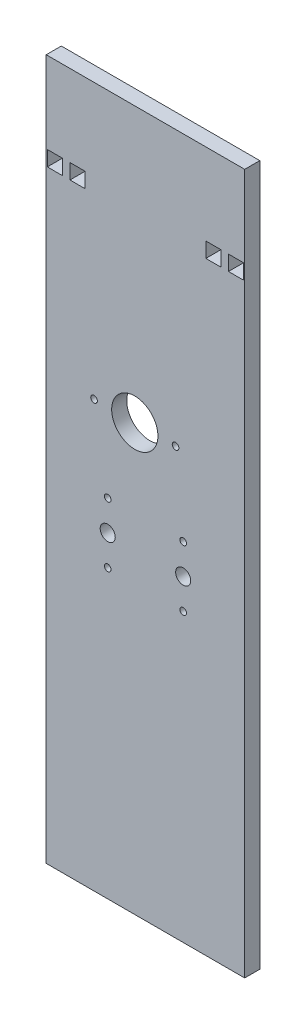
ISO-10303-21;
HEADER;
FILE_DESCRIPTION(('STEP AP214'),'2;1');
FILE_NAME('part.step','',(''),(''),'','','');
FILE_SCHEMA(('AUTOMOTIVE_DESIGN { 1 0 10303 214 1 1 1 1 }'));
ENDSEC;
DATA;
#1=APPLICATION_CONTEXT('core data for automotive mechanical design processes');
#2=APPLICATION_PROTOCOL_DEFINITION('international standard','automotive_design',2000,#1);
#3=PRODUCT_CONTEXT('',#1,'mechanical');
#4=PRODUCT('Part','Part','',(#3));
#5=PRODUCT_RELATED_PRODUCT_CATEGORY('part','',(#4));
#6=PRODUCT_DEFINITION_FORMATION('','',#4);
#7=PRODUCT_DEFINITION_CONTEXT('part definition',#1,'design');
#8=PRODUCT_DEFINITION('design','',#6,#7);
#9=PRODUCT_DEFINITION_SHAPE('','',#8);
#10=(LENGTH_UNIT() NAMED_UNIT(*) SI_UNIT(.MILLI.,.METRE.));
#11=(NAMED_UNIT(*) PLANE_ANGLE_UNIT() SI_UNIT($,.RADIAN.));
#12=(NAMED_UNIT(*) SI_UNIT($,.STERADIAN.) SOLID_ANGLE_UNIT());
#13=UNCERTAINTY_MEASURE_WITH_UNIT(LENGTH_MEASURE(1.E-05),#10,'distance_accuracy_value','');
#14=(GEOMETRIC_REPRESENTATION_CONTEXT(3) GLOBAL_UNCERTAINTY_ASSIGNED_CONTEXT((#13)) GLOBAL_UNIT_ASSIGNED_CONTEXT((#10,
#11,#12)) REPRESENTATION_CONTEXT('',''));
#15=CARTESIAN_POINT('',(0.,0.,0.));
#16=DIRECTION('',(0.,0.,1.));
#17=DIRECTION('',(1.,0.,0.));
#18=AXIS2_PLACEMENT_3D('',#15,#16,#17);
#19=CARTESIAN_POINT('',(0.,0.,6.35));
#20=DIRECTION('',(0.,0.,1.));
#21=DIRECTION('',(1.,0.,0.));
#22=AXIS2_PLACEMENT_3D('',#19,#20,#21);
#23=PLANE('',#22);
#24=DIRECTION('',(-1.,0.,0.));
#25=VECTOR('',#24,1.);
#26=CARTESIAN_POINT('',(16.35,260.35,6.35));
#27=LINE('',#26,#25);
#28=CARTESIAN_POINT('',(22.7000000000001,260.35,6.35));
#29=VERTEX_POINT('',#28);
#30=CARTESIAN_POINT('',(16.35,260.35,6.35));
#31=VERTEX_POINT('',#30);
#32=EDGE_CURVE('E391',#29,#31,#27,.T.);
#33=ORIENTED_EDGE('',*,*,#32,.F.);
#34=DIRECTION('',(0.,1.,0.));
#35=VECTOR('',#34,1.);
#36=CARTESIAN_POINT('',(22.7000000000001,260.35,6.35));
#37=LINE('',#36,#35);
#38=CARTESIAN_POINT('',(22.7000000000001,254.,6.35));
#39=VERTEX_POINT('',#38);
#40=EDGE_CURVE('E371',#39,#29,#37,.T.);
#41=ORIENTED_EDGE('',*,*,#40,.F.);
#42=DIRECTION('',(1.,0.,0.));
#43=VECTOR('',#42,1.);
#44=CARTESIAN_POINT('',(22.7000000000001,254.,6.35));
#45=LINE('',#44,#43);
#46=CARTESIAN_POINT('',(16.35,254.,6.35));
#47=VERTEX_POINT('',#46);
#48=EDGE_CURVE('E366',#47,#39,#45,.T.);
#49=ORIENTED_EDGE('',*,*,#48,.F.);
#50=DIRECTION('',(0.,-1.,0.));
#51=VECTOR('',#50,1.);
#52=CARTESIAN_POINT('',(16.35,254.,6.35));
#53=LINE('',#52,#51);
#54=EDGE_CURVE('E387',#31,#47,#53,.T.);
#55=ORIENTED_EDGE('',*,*,#54,.F.);
#56=EDGE_LOOP('',(#33,#41,#49,#55));
#57=FACE_BOUND('',#56,.T.);
#58=CARTESIAN_POINT('',(26.4649897975543,179.209178052848,6.35));
#59=DIRECTION('',(0.,0.,1.));
#60=DIRECTION('',(1.,0.,0.));
#61=AXIS2_PLACEMENT_3D('',#58,#59,#60);
#62=CIRCLE('',#61,1.38906250000001);
#63=CARTESIAN_POINT('',(27.8540522975543,179.209178052848,6.35));
#64=VERTEX_POINT('',#63);
#65=EDGE_CURVE('E341',#64,#64,#62,.T.);
#66=ORIENTED_EDGE('',*,*,#65,.F.);
#67=EDGE_LOOP('',(#66));
#68=FACE_BOUND('',#67,.T.);
#69=CARTESIAN_POINT('',(32.2250014,120.65,6.35));
#70=DIRECTION('',(0.,0.,1.));
#71=DIRECTION('',(1.,0.,0.));
#72=AXIS2_PLACEMENT_3D('',#69,#70,#71);
#73=CIRCLE('',#72,1.38906250000001);
#74=CARTESIAN_POINT('',(33.6140639,120.65,6.35));
#75=VERTEX_POINT('',#74);
#76=EDGE_CURVE('E325',#75,#75,#73,.T.);
#77=ORIENTED_EDGE('',*,*,#76,.F.);
#78=EDGE_LOOP('',(#77));
#79=FACE_BOUND('',#78,.T.);
#80=DIRECTION('',(0.,-1.,0.));
#81=VECTOR('',#80,1.);
#82=CARTESIAN_POINT('',(73.5,254.,6.35));
#83=LINE('',#82,#81);
#84=CARTESIAN_POINT('',(73.5,260.35,6.35));
#85=VERTEX_POINT('',#84);
#86=CARTESIAN_POINT('',(73.5,254.,6.35));
#87=VERTEX_POINT('',#86);
#88=EDGE_CURVE('E316',#85,#87,#83,.T.);
#89=ORIENTED_EDGE('',*,*,#88,.F.);
#90=DIRECTION('',(-1.,0.,0.));
#91=VECTOR('',#90,1.);
#92=CARTESIAN_POINT('',(73.5,260.35,6.35));
#93=LINE('',#92,#91);
#94=CARTESIAN_POINT('',(79.8500000000001,260.35,6.35));
#95=VERTEX_POINT('',#94);
#96=EDGE_CURVE('E296',#95,#85,#93,.T.);
#97=ORIENTED_EDGE('',*,*,#96,.F.);
#98=DIRECTION('',(0.,1.,0.));
#99=VECTOR('',#98,1.);
#100=CARTESIAN_POINT('',(79.8500000000001,260.35,6.35));
#101=LINE('',#100,#99);
#102=CARTESIAN_POINT('',(79.85,254.,6.35));
#103=VERTEX_POINT('',#102);
#104=EDGE_CURVE('E291',#103,#95,#101,.T.);
#105=ORIENTED_EDGE('',*,*,#104,.F.);
#106=DIRECTION('',(1.,0.,0.));
#107=VECTOR('',#106,1.);
#108=CARTESIAN_POINT('',(79.85,254.,6.35));
#109=LINE('',#108,#107);
#110=EDGE_CURVE('E312',#87,#103,#109,.T.);
#111=ORIENTED_EDGE('',*,*,#110,.F.);
#112=EDGE_LOOP('',(#89,#97,#105,#111));
#113=FACE_BOUND('',#112,.T.);
#114=CARTESIAN_POINT('',(32.2250014,146.05,6.35));
#115=DIRECTION('',(0.,0.,1.));
#116=DIRECTION('',(1.,0.,0.));
#117=AXIS2_PLACEMENT_3D('',#114,#115,#116);
#118=CIRCLE('',#117,1.38906250000001);
#119=CARTESIAN_POINT('',(33.6140639,146.05,6.35));
#120=VERTEX_POINT('',#119);
#121=EDGE_CURVE('E266',#120,#120,#118,.T.);
#122=ORIENTED_EDGE('',*,*,#121,.F.);
#123=EDGE_LOOP('',(#122));
#124=FACE_BOUND('',#123,.T.);
#125=CARTESIAN_POINT('',(63.9749986,133.35,6.35));
#126=DIRECTION('',(0.,0.,1.));
#127=DIRECTION('',(1.,0.,0.));
#128=AXIS2_PLACEMENT_3D('',#125,#126,#127);
#129=CIRCLE('',#128,3.175);
#130=CARTESIAN_POINT('',(67.1499986,133.35,6.35));
#131=VERTEX_POINT('',#130);
#132=EDGE_CURVE('E250',#131,#131,#129,.T.);
#133=ORIENTED_EDGE('',*,*,#132,.F.);
#134=EDGE_LOOP('',(#133));
#135=FACE_BOUND('',#134,.T.);
#136=DIRECTION('',(-1.,0.,0.));
#137=VECTOR('',#136,1.);
#138=CARTESIAN_POINT('',(83.025,260.35,6.35));
#139=LINE('',#138,#137);
#140=CARTESIAN_POINT('',(89.375,260.35,6.35));
#141=VERTEX_POINT('',#140);
#142=CARTESIAN_POINT('',(83.025,260.35,6.35));
#143=VERTEX_POINT('',#142);
#144=EDGE_CURVE('E241',#141,#143,#139,.T.);
#145=ORIENTED_EDGE('',*,*,#144,.F.);
#146=DIRECTION('',(0.,1.,0.));
#147=VECTOR('',#146,1.);
#148=CARTESIAN_POINT('',(89.375,260.35,6.35));
#149=LINE('',#148,#147);
#150=CARTESIAN_POINT('',(89.375,254.,6.35));
#151=VERTEX_POINT('',#150);
#152=EDGE_CURVE('E221',#151,#141,#149,.T.);
#153=ORIENTED_EDGE('',*,*,#152,.F.);
#154=DIRECTION('',(1.,0.,0.));
#155=VECTOR('',#154,1.);
#156=CARTESIAN_POINT('',(89.375,254.,6.35));
#157=LINE('',#156,#155);
#158=CARTESIAN_POINT('',(83.025,254.,6.35));
#159=VERTEX_POINT('',#158);
#160=EDGE_CURVE('E216',#159,#151,#157,.T.);
#161=ORIENTED_EDGE('',*,*,#160,.F.);
#162=DIRECTION('',(0.,-1.,0.));
#163=VECTOR('',#162,1.);
#164=CARTESIAN_POINT('',(83.025,254.,6.35));
#165=LINE('',#164,#163);
#166=EDGE_CURVE('E237',#143,#159,#165,.T.);
#167=ORIENTED_EDGE('',*,*,#166,.F.);
#168=EDGE_LOOP('',(#145,#153,#161,#167));
#169=FACE_BOUND('',#168,.T.);
#170=CARTESIAN_POINT('',(63.9749986,120.65,6.35));
#171=DIRECTION('',(0.,0.,1.));
#172=DIRECTION('',(1.,0.,0.));
#173=AXIS2_PLACEMENT_3D('',#170,#171,#172);
#174=CIRCLE('',#173,1.38906250000002);
#175=CARTESIAN_POINT('',(65.3640611,120.65,6.35));
#176=VERTEX_POINT('',#175);
#177=EDGE_CURVE('E234',#176,#176,#174,.T.);
#178=ORIENTED_EDGE('',*,*,#177,.F.);
#179=EDGE_LOOP('',(#178));
#180=FACE_BOUND('',#179,.T.);
#181=CARTESIAN_POINT('',(63.9749986,146.05,6.35));
#182=DIRECTION('',(0.,0.,1.));
#183=DIRECTION('',(1.,0.,0.));
#184=AXIS2_PLACEMENT_3D('',#181,#182,#183);
#185=CIRCLE('',#184,1.38906250000002);
#186=CARTESIAN_POINT('',(65.3640611,146.05,6.35));
#187=VERTEX_POINT('',#186);
#188=EDGE_CURVE('E258',#187,#187,#185,.T.);
#189=ORIENTED_EDGE('',*,*,#188,.F.);
#190=EDGE_LOOP('',(#189));
#191=FACE_BOUND('',#190,.T.);
#192=CARTESIAN_POINT('',(32.2250014,133.35,6.35));
#193=DIRECTION('',(0.,0.,1.));
#194=DIRECTION('',(1.,0.,0.));
#195=AXIS2_PLACEMENT_3D('',#192,#193,#194);
#196=CIRCLE('',#195,3.175);
#197=CARTESIAN_POINT('',(35.4000014,133.35,6.35));
#198=VERTEX_POINT('',#197);
#199=EDGE_CURVE('E309',#198,#198,#196,.T.);
#200=ORIENTED_EDGE('',*,*,#199,.F.);
#201=EDGE_LOOP('',(#200));
#202=FACE_BOUND('',#201,.T.);
#203=CARTESIAN_POINT('',(60.7549897975543,179.209178052848,6.35));
#204=DIRECTION('',(0.,0.,1.));
#205=DIRECTION('',(1.,0.,0.));
#206=AXIS2_PLACEMENT_3D('',#203,#204,#205);
#207=CIRCLE('',#206,1.3890625);
#208=CARTESIAN_POINT('',(62.1440522975543,179.209178052848,6.35));
#209=VERTEX_POINT('',#208);
#210=EDGE_CURVE('E333',#209,#209,#207,.T.);
#211=ORIENTED_EDGE('',*,*,#210,.F.);
#212=EDGE_LOOP('',(#211));
#213=FACE_BOUND('',#212,.T.);
#214=CARTESIAN_POINT('',(43.6099897975543,179.209178052848,6.35));
#215=DIRECTION('',(0.,0.,1.));
#216=DIRECTION('',(1.,0.,0.));
#217=AXIS2_PLACEMENT_3D('',#214,#215,#216);
#218=CIRCLE('',#217,9.72819999999998);
#219=CARTESIAN_POINT('',(53.3381897975542,179.209178052848,6.35));
#220=VERTEX_POINT('',#219);
#221=EDGE_CURVE('E384',#220,#220,#218,.T.);
#222=ORIENTED_EDGE('',*,*,#221,.F.);
#223=EDGE_LOOP('',(#222));
#224=FACE_BOUND('',#223,.T.);
#225=DIRECTION('',(0.,1.,0.));
#226=VECTOR('',#225,1.);
#227=CARTESIAN_POINT('',(13.1750000000001,260.35,6.35));
#228=LINE('',#227,#226);
#229=CARTESIAN_POINT('',(13.1750000000001,254.,6.35));
#230=VERTEX_POINT('',#229);
#231=CARTESIAN_POINT('',(13.1750000000001,260.35,6.35));
#232=VERTEX_POINT('',#231);
#233=EDGE_CURVE('E442',#230,#232,#228,.T.);
#234=ORIENTED_EDGE('',*,*,#233,.F.);
#235=DIRECTION('',(1.,0.,0.));
#236=VECTOR('',#235,1.);
#237=CARTESIAN_POINT('',(13.1750000000001,254.,6.35));
#238=LINE('',#237,#236);
#239=CARTESIAN_POINT('',(6.82500000000007,254.,6.35));
#240=VERTEX_POINT('',#239);
#241=EDGE_CURVE('E422',#240,#230,#238,.T.);
#242=ORIENTED_EDGE('',*,*,#241,.F.);
#243=DIRECTION('',(0.,-1.,0.));
#244=VECTOR('',#243,1.);
#245=CARTESIAN_POINT('',(6.82500000000007,254.,6.35));
#246=LINE('',#245,#244);
#247=CARTESIAN_POINT('',(6.82500000000007,260.35,6.35));
#248=VERTEX_POINT('',#247);
#249=EDGE_CURVE('E417',#248,#240,#246,.T.);
#250=ORIENTED_EDGE('',*,*,#249,.F.);
#251=DIRECTION('',(-1.,0.,0.));
#252=VECTOR('',#251,1.);
#253=CARTESIAN_POINT('',(6.82500000000007,260.35,6.35));
#254=LINE('',#253,#252);
#255=EDGE_CURVE('E438',#232,#248,#254,.T.);
#256=ORIENTED_EDGE('',*,*,#255,.F.);
#257=EDGE_LOOP('',(#234,#242,#250,#256));
#258=FACE_BOUND('',#257,.T.);
#259=DIRECTION('',(1.,0.,0.));
#260=VECTOR('',#259,1.);
#261=CARTESIAN_POINT('',(0.,0.,6.35));
#262=LINE('',#261,#260);
#263=CARTESIAN_POINT('',(6.35,0.,6.35));
#264=VERTEX_POINT('',#263);
#265=CARTESIAN_POINT('',(89.85,0.,6.35));
#266=VERTEX_POINT('',#265);
#267=EDGE_CURVE('E49',#264,#266,#262,.T.);
#268=ORIENTED_EDGE('',*,*,#267,.T.);
#269=DIRECTION('',(0.,-1.,0.));
#270=VECTOR('',#269,1.);
#271=CARTESIAN_POINT('',(89.85,294.64,6.35));
#272=LINE('',#271,#270);
#273=CARTESIAN_POINT('',(89.85,294.64,6.35));
#274=VERTEX_POINT('',#273);
#275=EDGE_CURVE('E179',#274,#266,#272,.T.);
#276=ORIENTED_EDGE('',*,*,#275,.F.);
#277=DIRECTION('',(-1.,0.,0.));
#278=VECTOR('',#277,1.);
#279=CARTESIAN_POINT('',(96.2,294.64,6.35));
#280=LINE('',#279,#278);
#281=CARTESIAN_POINT('',(6.34999999999999,294.64,6.35));
#282=VERTEX_POINT('',#281);
#283=EDGE_CURVE('E11',#274,#282,#280,.T.);
#284=ORIENTED_EDGE('',*,*,#283,.T.);
#285=DIRECTION('',(0.,1.,0.));
#286=VECTOR('',#285,1.);
#287=CARTESIAN_POINT('',(6.35,0.,6.35));
#288=LINE('',#287,#286);
#289=EDGE_CURVE('E435',#264,#282,#288,.T.);
#290=ORIENTED_EDGE('',*,*,#289,.F.);
#291=EDGE_LOOP('',(#268,#276,#284,#290));
#292=FACE_BOUND('',#291,.T.);
#293=ADVANCED_FACE('F39',(#57,#68,#79,#113,#124,#135,#169,#180,#191,#202,#213,#224,#258,#292),
#23,.T.);
#294=CARTESIAN_POINT('',(0.,0.,0.));
#295=DIRECTION('',(0.,0.,1.));
#296=DIRECTION('',(1.,0.,0.));
#297=AXIS2_PLACEMENT_3D('',#294,#295,#296);
#298=PLANE('',#297);
#299=CARTESIAN_POINT('',(43.6099897975543,179.209178052848,0.));
#300=DIRECTION('',(0.,0.,1.));
#301=DIRECTION('',(1.,0.,0.));
#302=AXIS2_PLACEMENT_3D('',#299,#300,#301);
#303=CIRCLE('',#302,9.72819999999998);
#304=CARTESIAN_POINT('',(53.3381897975542,179.209178052848,0.));
#305=VERTEX_POINT('',#304);
#306=EDGE_CURVE('E396',#305,#305,#303,.T.);
#307=ORIENTED_EDGE('',*,*,#306,.T.);
#308=EDGE_LOOP('',(#307));
#309=FACE_BOUND('',#308,.T.);
#310=DIRECTION('',(0.,1.,0.));
#311=VECTOR('',#310,1.);
#312=CARTESIAN_POINT('',(22.7000000000001,260.35,0.));
#313=LINE('',#312,#311);
#314=CARTESIAN_POINT('',(22.7000000000001,254.,0.));
#315=VERTEX_POINT('',#314);
#316=CARTESIAN_POINT('',(22.7000000000001,260.35,0.));
#317=VERTEX_POINT('',#316);
#318=EDGE_CURVE('E380',#315,#317,#313,.T.);
#319=ORIENTED_EDGE('',*,*,#318,.T.);
#320=DIRECTION('',(-1.,0.,0.));
#321=VECTOR('',#320,1.);
#322=CARTESIAN_POINT('',(16.35,260.35,0.));
#323=LINE('',#322,#321);
#324=CARTESIAN_POINT('',(16.35,260.35,0.));
#325=VERTEX_POINT('',#324);
#326=EDGE_CURVE('E376',#317,#325,#323,.T.);
#327=ORIENTED_EDGE('',*,*,#326,.T.);
#328=DIRECTION('',(0.,-1.,0.));
#329=VECTOR('',#328,1.);
#330=CARTESIAN_POINT('',(16.35,254.,0.));
#331=LINE('',#330,#329);
#332=CARTESIAN_POINT('',(16.35,254.,0.));
#333=VERTEX_POINT('',#332);
#334=EDGE_CURVE('E372',#325,#333,#331,.T.);
#335=ORIENTED_EDGE('',*,*,#334,.T.);
#336=DIRECTION('',(1.,0.,0.));
#337=VECTOR('',#336,1.);
#338=CARTESIAN_POINT('',(22.7000000000001,254.,0.));
#339=LINE('',#338,#337);
#340=EDGE_CURVE('E367',#333,#315,#339,.T.);
#341=ORIENTED_EDGE('',*,*,#340,.T.);
#342=EDGE_LOOP('',(#319,#327,#335,#341));
#343=FACE_BOUND('',#342,.T.);
#344=CARTESIAN_POINT('',(32.2250014,146.05,0.));
#345=DIRECTION('',(0.,0.,1.));
#346=DIRECTION('',(1.,0.,0.));
#347=AXIS2_PLACEMENT_3D('',#344,#345,#346);
#348=CIRCLE('',#347,1.38906250000001);
#349=CARTESIAN_POINT('',(33.6140639,146.05,0.));
#350=VERTEX_POINT('',#349);
#351=EDGE_CURVE('E270',#350,#350,#348,.T.);
#352=ORIENTED_EDGE('',*,*,#351,.T.);
#353=EDGE_LOOP('',(#352));
#354=FACE_BOUND('',#353,.T.);
#355=CARTESIAN_POINT('',(63.9749986,146.05,0.));
#356=DIRECTION('',(0.,0.,1.));
#357=DIRECTION('',(1.,0.,0.));
#358=AXIS2_PLACEMENT_3D('',#355,#356,#357);
#359=CIRCLE('',#358,1.38906250000002);
#360=CARTESIAN_POINT('',(65.3640611,146.05,0.));
#361=VERTEX_POINT('',#360);
#362=EDGE_CURVE('E262',#361,#361,#359,.T.);
#363=ORIENTED_EDGE('',*,*,#362,.T.);
#364=EDGE_LOOP('',(#363));
#365=FACE_BOUND('',#364,.T.);
#366=CARTESIAN_POINT('',(63.9749986,133.35,0.));
#367=DIRECTION('',(0.,0.,1.));
#368=DIRECTION('',(1.,0.,0.));
#369=AXIS2_PLACEMENT_3D('',#366,#367,#368);
#370=CIRCLE('',#369,3.175);
#371=CARTESIAN_POINT('',(67.1499986,133.35,0.));
#372=VERTEX_POINT('',#371);
#373=EDGE_CURVE('E254',#372,#372,#370,.T.);
#374=ORIENTED_EDGE('',*,*,#373,.T.);
#375=EDGE_LOOP('',(#374));
#376=FACE_BOUND('',#375,.T.);
#377=CARTESIAN_POINT('',(63.9749986,120.65,0.));
#378=DIRECTION('',(0.,0.,1.));
#379=DIRECTION('',(1.,0.,0.));
#380=AXIS2_PLACEMENT_3D('',#377,#378,#379);
#381=CIRCLE('',#380,1.38906250000002);
#382=CARTESIAN_POINT('',(65.3640611,120.65,0.));
#383=VERTEX_POINT('',#382);
#384=EDGE_CURVE('E246',#383,#383,#381,.T.);
#385=ORIENTED_EDGE('',*,*,#384,.T.);
#386=EDGE_LOOP('',(#385));
#387=FACE_BOUND('',#386,.T.);
#388=DIRECTION('',(0.,1.,0.));
#389=VECTOR('',#388,1.);
#390=CARTESIAN_POINT('',(89.375,260.35,0.));
#391=LINE('',#390,#389);
#392=CARTESIAN_POINT('',(89.375,254.,0.));
#393=VERTEX_POINT('',#392);
#394=CARTESIAN_POINT('',(89.375,260.35,0.));
#395=VERTEX_POINT('',#394);
#396=EDGE_CURVE('E230',#393,#395,#391,.T.);
#397=ORIENTED_EDGE('',*,*,#396,.T.);
#398=DIRECTION('',(-1.,0.,0.));
#399=VECTOR('',#398,1.);
#400=CARTESIAN_POINT('',(83.025,260.35,0.));
#401=LINE('',#400,#399);
#402=CARTESIAN_POINT('',(83.025,260.35,0.));
#403=VERTEX_POINT('',#402);
#404=EDGE_CURVE('E226',#395,#403,#401,.T.);
#405=ORIENTED_EDGE('',*,*,#404,.T.);
#406=DIRECTION('',(0.,-1.,0.));
#407=VECTOR('',#406,1.);
#408=CARTESIAN_POINT('',(83.025,254.,0.));
#409=LINE('',#408,#407);
#410=CARTESIAN_POINT('',(83.025,254.,0.));
#411=VERTEX_POINT('',#410);
#412=EDGE_CURVE('E222',#403,#411,#409,.T.);
#413=ORIENTED_EDGE('',*,*,#412,.T.);
#414=DIRECTION('',(1.,0.,0.));
#415=VECTOR('',#414,1.);
#416=CARTESIAN_POINT('',(89.375,254.,0.));
#417=LINE('',#416,#415);
#418=EDGE_CURVE('E217',#411,#393,#417,.T.);
#419=ORIENTED_EDGE('',*,*,#418,.T.);
#420=EDGE_LOOP('',(#397,#405,#413,#419));
#421=FACE_BOUND('',#420,.T.);
#422=DIRECTION('',(-1.,0.,0.));
#423=VECTOR('',#422,1.);
#424=CARTESIAN_POINT('',(73.5,260.35,0.));
#425=LINE('',#424,#423);
#426=CARTESIAN_POINT('',(79.8500000000001,260.35,0.));
#427=VERTEX_POINT('',#426);
#428=CARTESIAN_POINT('',(73.5,260.35,0.));
#429=VERTEX_POINT('',#428);
#430=EDGE_CURVE('E305',#427,#429,#425,.T.);
#431=ORIENTED_EDGE('',*,*,#430,.T.);
#432=DIRECTION('',(0.,-1.,0.));
#433=VECTOR('',#432,1.);
#434=CARTESIAN_POINT('',(73.5,254.,0.));
#435=LINE('',#434,#433);
#436=CARTESIAN_POINT('',(73.5,254.,0.));
#437=VERTEX_POINT('',#436);
#438=EDGE_CURVE('E301',#429,#437,#435,.T.);
#439=ORIENTED_EDGE('',*,*,#438,.T.);
#440=DIRECTION('',(1.,0.,0.));
#441=VECTOR('',#440,1.);
#442=CARTESIAN_POINT('',(79.85,254.,0.));
#443=LINE('',#442,#441);
#444=CARTESIAN_POINT('',(79.85,254.,0.));
#445=VERTEX_POINT('',#444);
#446=EDGE_CURVE('E297',#437,#445,#443,.T.);
#447=ORIENTED_EDGE('',*,*,#446,.T.);
#448=DIRECTION('',(0.,1.,0.));
#449=VECTOR('',#448,1.);
#450=CARTESIAN_POINT('',(79.8500000000001,260.35,0.));
#451=LINE('',#450,#449);
#452=EDGE_CURVE('E292',#445,#427,#451,.T.);
#453=ORIENTED_EDGE('',*,*,#452,.T.);
#454=EDGE_LOOP('',(#431,#439,#447,#453));
#455=FACE_BOUND('',#454,.T.);
#456=CARTESIAN_POINT('',(32.2250014,133.35,0.));
#457=DIRECTION('',(0.,0.,1.));
#458=DIRECTION('',(1.,0.,0.));
#459=AXIS2_PLACEMENT_3D('',#456,#457,#458);
#460=CIRCLE('',#459,3.175);
#461=CARTESIAN_POINT('',(35.4000014,133.35,0.));
#462=VERTEX_POINT('',#461);
#463=EDGE_CURVE('E321',#462,#462,#460,.T.);
#464=ORIENTED_EDGE('',*,*,#463,.T.);
#465=EDGE_LOOP('',(#464));
#466=FACE_BOUND('',#465,.T.);
#467=CARTESIAN_POINT('',(32.2250014,120.65,0.));
#468=DIRECTION('',(0.,0.,1.));
#469=DIRECTION('',(1.,0.,0.));
#470=AXIS2_PLACEMENT_3D('',#467,#468,#469);
#471=CIRCLE('',#470,1.38906250000001);
#472=CARTESIAN_POINT('',(33.6140639,120.65,0.));
#473=VERTEX_POINT('',#472);
#474=EDGE_CURVE('E329',#473,#473,#471,.T.);
#475=ORIENTED_EDGE('',*,*,#474,.T.);
#476=EDGE_LOOP('',(#475));
#477=FACE_BOUND('',#476,.T.);
#478=CARTESIAN_POINT('',(60.7549897975543,179.209178052848,0.));
#479=DIRECTION('',(0.,0.,1.));
#480=DIRECTION('',(1.,0.,0.));
#481=AXIS2_PLACEMENT_3D('',#478,#479,#480);
#482=CIRCLE('',#481,1.3890625);
#483=CARTESIAN_POINT('',(62.1440522975543,179.209178052848,0.));
#484=VERTEX_POINT('',#483);
#485=EDGE_CURVE('E337',#484,#484,#482,.T.);
#486=ORIENTED_EDGE('',*,*,#485,.T.);
#487=EDGE_LOOP('',(#486));
#488=FACE_BOUND('',#487,.T.);
#489=CARTESIAN_POINT('',(26.4649897975543,179.209178052848,0.));
#490=DIRECTION('',(0.,0.,1.));
#491=DIRECTION('',(1.,0.,0.));
#492=AXIS2_PLACEMENT_3D('',#489,#490,#491);
#493=CIRCLE('',#492,1.38906250000001);
#494=CARTESIAN_POINT('',(27.8540522975543,179.209178052848,0.));
#495=VERTEX_POINT('',#494);
#496=EDGE_CURVE('E345',#495,#495,#493,.T.);
#497=ORIENTED_EDGE('',*,*,#496,.T.);
#498=EDGE_LOOP('',(#497));
#499=FACE_BOUND('',#498,.T.);
#500=DIRECTION('',(1.,0.,0.));
#501=VECTOR('',#500,1.);
#502=CARTESIAN_POINT('',(13.1750000000001,254.,0.));
#503=LINE('',#502,#501);
#504=CARTESIAN_POINT('',(6.82500000000007,254.,0.));
#505=VERTEX_POINT('',#504);
#506=CARTESIAN_POINT('',(13.1750000000001,254.,0.));
#507=VERTEX_POINT('',#506);
#508=EDGE_CURVE('E431',#505,#507,#503,.T.);
#509=ORIENTED_EDGE('',*,*,#508,.T.);
#510=DIRECTION('',(0.,1.,0.));
#511=VECTOR('',#510,1.);
#512=CARTESIAN_POINT('',(13.1750000000001,260.35,0.));
#513=LINE('',#512,#511);
#514=CARTESIAN_POINT('',(13.1750000000001,260.35,0.));
#515=VERTEX_POINT('',#514);
#516=EDGE_CURVE('E427',#507,#515,#513,.T.);
#517=ORIENTED_EDGE('',*,*,#516,.T.);
#518=DIRECTION('',(-1.,0.,0.));
#519=VECTOR('',#518,1.);
#520=CARTESIAN_POINT('',(6.82500000000007,260.35,0.));
#521=LINE('',#520,#519);
#522=CARTESIAN_POINT('',(6.82500000000007,260.35,0.));
#523=VERTEX_POINT('',#522);
#524=EDGE_CURVE('E423',#515,#523,#521,.T.);
#525=ORIENTED_EDGE('',*,*,#524,.T.);
#526=DIRECTION('',(0.,-1.,0.));
#527=VECTOR('',#526,1.);
#528=CARTESIAN_POINT('',(6.82500000000007,254.,0.));
#529=LINE('',#528,#527);
#530=EDGE_CURVE('E418',#523,#505,#529,.T.);
#531=ORIENTED_EDGE('',*,*,#530,.T.);
#532=EDGE_LOOP('',(#509,#517,#525,#531));
#533=FACE_BOUND('',#532,.T.);
#534=DIRECTION('',(0.,1.,0.));
#535=VECTOR('',#534,1.);
#536=CARTESIAN_POINT('',(89.85,0.,0.));
#537=LINE('',#536,#535);
#538=CARTESIAN_POINT('',(89.85,0.,0.));
#539=VERTEX_POINT('',#538);
#540=CARTESIAN_POINT('',(89.85,294.64,0.));
#541=VERTEX_POINT('',#540);
#542=EDGE_CURVE('E57',#539,#541,#537,.T.);
#543=ORIENTED_EDGE('',*,*,#542,.F.);
#544=DIRECTION('',(1.,0.,0.));
#545=VECTOR('',#544,1.);
#546=CARTESIAN_POINT('',(0.,0.,0.));
#547=LINE('',#546,#545);
#548=CARTESIAN_POINT('',(6.35,0.,0.));
#549=VERTEX_POINT('',#548);
#550=EDGE_CURVE('E191',#549,#539,#547,.T.);
#551=ORIENTED_EDGE('',*,*,#550,.F.);
#552=DIRECTION('',(0.,-1.,0.));
#553=VECTOR('',#552,1.);
#554=CARTESIAN_POINT('',(6.35,294.64,0.));
#555=LINE('',#554,#553);
#556=CARTESIAN_POINT('',(6.35,294.64,0.));
#557=VERTEX_POINT('',#556);
#558=EDGE_CURVE('E451',#557,#549,#555,.T.);
#559=ORIENTED_EDGE('',*,*,#558,.F.);
#560=DIRECTION('',(-1.,0.,0.));
#561=VECTOR('',#560,1.);
#562=CARTESIAN_POINT('',(96.2,294.64,0.));
#563=LINE('',#562,#561);
#564=EDGE_CURVE('E43',#541,#557,#563,.T.);
#565=ORIENTED_EDGE('',*,*,#564,.F.);
#566=EDGE_LOOP('',(#543,#551,#559,#565));
#567=FACE_BOUND('',#566,.T.);
#568=ADVANCED_FACE('F189',(#309,#343,#354,#365,#376,#387,#421,#455,#466,#477,#488,#499,#533,
#567),#298,.F.);
#569=CARTESIAN_POINT('',(0.,0.,6.35));
#570=DIRECTION('',(0.,1.,0.));
#571=DIRECTION('',(0.,0.,1.));
#572=AXIS2_PLACEMENT_3D('',#569,#570,#571);
#573=PLANE('',#572);
#574=DIRECTION('',(0.,0.,-1.));
#575=VECTOR('',#574,1.);
#576=CARTESIAN_POINT('',(89.85,0.,6.35));
#577=LINE('',#576,#575);
#578=EDGE_CURVE('E177',#266,#539,#577,.T.);
#579=ORIENTED_EDGE('',*,*,#578,.F.);
#580=ORIENTED_EDGE('',*,*,#267,.F.);
#581=DIRECTION('',(0.,0.,1.));
#582=VECTOR('',#581,1.);
#583=CARTESIAN_POINT('',(6.35,0.,0.));
#584=LINE('',#583,#582);
#585=EDGE_CURVE('E196',#549,#264,#584,.T.);
#586=ORIENTED_EDGE('',*,*,#585,.F.);
#587=ORIENTED_EDGE('',*,*,#550,.T.);
#588=EDGE_LOOP('',(#579,#580,#586,#587));
#589=FACE_BOUND('',#588,.T.);
#590=ADVANCED_FACE('F41',(#589),#573,.F.);
#591=CARTESIAN_POINT('',(96.2,294.64,6.35));
#592=DIRECTION('',(0.,-1.,0.));
#593=DIRECTION('',(0.,0.,-1.));
#594=AXIS2_PLACEMENT_3D('',#591,#592,#593);
#595=PLANE('',#594);
#596=DIRECTION('',(0.,0.,1.));
#597=VECTOR('',#596,1.);
#598=CARTESIAN_POINT('',(89.85,294.64,0.));
#599=LINE('',#598,#597);
#600=EDGE_CURVE('E193',#541,#274,#599,.T.);
#601=ORIENTED_EDGE('',*,*,#600,.F.);
#602=ORIENTED_EDGE('',*,*,#564,.T.);
#603=DIRECTION('',(0.,0.,-1.));
#604=VECTOR('',#603,1.);
#605=CARTESIAN_POINT('',(6.35,294.64,6.35));
#606=LINE('',#605,#604);
#607=EDGE_CURVE('E454',#282,#557,#606,.T.);
#608=ORIENTED_EDGE('',*,*,#607,.F.);
#609=ORIENTED_EDGE('',*,*,#283,.F.);
#610=EDGE_LOOP('',(#601,#602,#608,#609));
#611=FACE_BOUND('',#610,.T.);
#612=ADVANCED_FACE('F463',(#611),#595,.F.);
#613=CARTESIAN_POINT('',(89.375,260.35,6.35));
#614=DIRECTION('',(-1.,0.,0.));
#615=DIRECTION('',(0.,0.,1.));
#616=AXIS2_PLACEMENT_3D('',#613,#614,#615);
#617=PLANE('',#616);
#618=ORIENTED_EDGE('',*,*,#396,.F.);
#619=DIRECTION('',(0.,0.,-1.));
#620=VECTOR('',#619,1.);
#621=CARTESIAN_POINT('',(89.375,254.,6.35));
#622=LINE('',#621,#620);
#623=EDGE_CURVE('E212',#151,#393,#622,.T.);
#624=ORIENTED_EDGE('',*,*,#623,.F.);
#625=ORIENTED_EDGE('',*,*,#152,.T.);
#626=DIRECTION('',(0.,0.,-1.));
#627=VECTOR('',#626,1.);
#628=CARTESIAN_POINT('',(89.375,260.35,6.35));
#629=LINE('',#628,#627);
#630=EDGE_CURVE('E198',#141,#395,#629,.T.);
#631=ORIENTED_EDGE('',*,*,#630,.T.);
#632=EDGE_LOOP('',(#618,#624,#625,#631));
#633=FACE_BOUND('',#632,.T.);
#634=ADVANCED_FACE('F488',(#633),#617,.T.);
#635=CARTESIAN_POINT('',(83.025,260.35,6.35));
#636=DIRECTION('',(0.,-1.,0.));
#637=DIRECTION('',(0.,0.,-1.));
#638=AXIS2_PLACEMENT_3D('',#635,#636,#637);
#639=PLANE('',#638);
#640=ORIENTED_EDGE('',*,*,#404,.F.);
#641=ORIENTED_EDGE('',*,*,#630,.F.);
#642=ORIENTED_EDGE('',*,*,#144,.T.);
#643=DIRECTION('',(0.,0.,-1.));
#644=VECTOR('',#643,1.);
#645=CARTESIAN_POINT('',(83.025,260.35,6.35));
#646=LINE('',#645,#644);
#647=EDGE_CURVE('E202',#143,#403,#646,.T.);
#648=ORIENTED_EDGE('',*,*,#647,.T.);
#649=EDGE_LOOP('',(#640,#641,#642,#648));
#650=FACE_BOUND('',#649,.T.);
#651=ADVANCED_FACE('F495',(#650),#639,.T.);
#652=CARTESIAN_POINT('',(83.025,254.,6.35));
#653=DIRECTION('',(1.,0.,0.));
#654=DIRECTION('',(0.,1.,0.));
#655=AXIS2_PLACEMENT_3D('',#652,#653,#654);
#656=PLANE('',#655);
#657=ORIENTED_EDGE('',*,*,#412,.F.);
#658=ORIENTED_EDGE('',*,*,#647,.F.);
#659=ORIENTED_EDGE('',*,*,#166,.T.);
#660=DIRECTION('',(0.,0.,-1.));
#661=VECTOR('',#660,1.);
#662=CARTESIAN_POINT('',(83.025,254.,6.35));
#663=LINE('',#662,#661);
#664=EDGE_CURVE('E209',#159,#411,#663,.T.);
#665=ORIENTED_EDGE('',*,*,#664,.T.);
#666=EDGE_LOOP('',(#657,#658,#659,#665));
#667=FACE_BOUND('',#666,.T.);
#668=ADVANCED_FACE('F728',(#667),#656,.T.);
#669=CARTESIAN_POINT('',(89.375,254.,6.35));
#670=DIRECTION('',(0.,1.,0.));
#671=DIRECTION('',(0.,0.,1.));
#672=AXIS2_PLACEMENT_3D('',#669,#670,#671);
#673=PLANE('',#672);
#674=ORIENTED_EDGE('',*,*,#418,.F.);
#675=ORIENTED_EDGE('',*,*,#664,.F.);
#676=ORIENTED_EDGE('',*,*,#160,.T.);
#677=ORIENTED_EDGE('',*,*,#623,.T.);
#678=EDGE_LOOP('',(#674,#675,#676,#677));
#679=FACE_BOUND('',#678,.T.);
#680=ADVANCED_FACE('F718',(#679),#673,.T.);
#681=CARTESIAN_POINT('',(63.9749986,120.65,6.35));
#682=DIRECTION('',(0.,0.,-1.));
#683=DIRECTION('',(-1.,0.,0.));
#684=AXIS2_PLACEMENT_3D('',#681,#682,#683);
#685=CYLINDRICAL_SURFACE('',#684,1.38906250000002);
#686=ORIENTED_EDGE('',*,*,#177,.T.);
#687=EDGE_LOOP('',(#686));
#688=FACE_BOUND('',#687,.T.);
#689=ORIENTED_EDGE('',*,*,#384,.F.);
#690=EDGE_LOOP('',(#689));
#691=FACE_BOUND('',#690,.T.);
#692=ADVANCED_FACE('F708',(#688,#691),#685,.F.);
#693=CARTESIAN_POINT('',(63.9749986,133.35,6.35));
#694=DIRECTION('',(0.,0.,-1.));
#695=DIRECTION('',(-1.,0.,0.));
#696=AXIS2_PLACEMENT_3D('',#693,#694,#695);
#697=CYLINDRICAL_SURFACE('',#696,3.175);
#698=ORIENTED_EDGE('',*,*,#132,.T.);
#699=EDGE_LOOP('',(#698));
#700=FACE_BOUND('',#699,.T.);
#701=ORIENTED_EDGE('',*,*,#373,.F.);
#702=EDGE_LOOP('',(#701));
#703=FACE_BOUND('',#702,.T.);
#704=ADVANCED_FACE('F698',(#700,#703),#697,.F.);
#705=CARTESIAN_POINT('',(63.9749986,146.05,6.35));
#706=DIRECTION('',(0.,0.,-1.));
#707=DIRECTION('',(-1.,0.,0.));
#708=AXIS2_PLACEMENT_3D('',#705,#706,#707);
#709=CYLINDRICAL_SURFACE('',#708,1.38906250000002);
#710=ORIENTED_EDGE('',*,*,#188,.T.);
#711=EDGE_LOOP('',(#710));
#712=FACE_BOUND('',#711,.T.);
#713=ORIENTED_EDGE('',*,*,#362,.F.);
#714=EDGE_LOOP('',(#713));
#715=FACE_BOUND('',#714,.T.);
#716=ADVANCED_FACE('F688',(#712,#715),#709,.F.);
#717=CARTESIAN_POINT('',(32.2250014,146.05,6.35));
#718=DIRECTION('',(0.,0.,-1.));
#719=DIRECTION('',(-1.,0.,0.));
#720=AXIS2_PLACEMENT_3D('',#717,#718,#719);
#721=CYLINDRICAL_SURFACE('',#720,1.38906250000001);
#722=ORIENTED_EDGE('',*,*,#121,.T.);
#723=EDGE_LOOP('',(#722));
#724=FACE_BOUND('',#723,.T.);
#725=ORIENTED_EDGE('',*,*,#351,.F.);
#726=EDGE_LOOP('',(#725));
#727=FACE_BOUND('',#726,.T.);
#728=ADVANCED_FACE('F678',(#724,#727),#721,.F.);
#729=CARTESIAN_POINT('',(73.5,260.35,6.35));
#730=DIRECTION('',(0.,-1.,0.));
#731=DIRECTION('',(1.,0.,0.));
#732=AXIS2_PLACEMENT_3D('',#729,#730,#731);
#733=PLANE('',#732);
#734=ORIENTED_EDGE('',*,*,#430,.F.);
#735=DIRECTION('',(0.,0.,-1.));
#736=VECTOR('',#735,1.);
#737=CARTESIAN_POINT('',(79.8500000000001,260.35,6.35));
#738=LINE('',#737,#736);
#739=EDGE_CURVE('E287',#95,#427,#738,.T.);
#740=ORIENTED_EDGE('',*,*,#739,.F.);
#741=ORIENTED_EDGE('',*,*,#96,.T.);
#742=DIRECTION('',(0.,0.,-1.));
#743=VECTOR('',#742,1.);
#744=CARTESIAN_POINT('',(73.5,260.35,6.35));
#745=LINE('',#744,#743);
#746=EDGE_CURVE('E274',#85,#429,#745,.T.);
#747=ORIENTED_EDGE('',*,*,#746,.T.);
#748=EDGE_LOOP('',(#734,#740,#741,#747));
#749=FACE_BOUND('',#748,.T.);
#750=ADVANCED_FACE('F668',(#749),#733,.T.);
#751=CARTESIAN_POINT('',(73.5,254.,6.35));
#752=DIRECTION('',(1.,0.,0.));
#753=DIRECTION('',(0.,1.,0.));
#754=AXIS2_PLACEMENT_3D('',#751,#752,#753);
#755=PLANE('',#754);
#756=ORIENTED_EDGE('',*,*,#438,.F.);
#757=ORIENTED_EDGE('',*,*,#746,.F.);
#758=ORIENTED_EDGE('',*,*,#88,.T.);
#759=DIRECTION('',(0.,0.,-1.));
#760=VECTOR('',#759,1.);
#761=CARTESIAN_POINT('',(73.5,254.,6.35));
#762=LINE('',#761,#760);
#763=EDGE_CURVE('E281',#87,#437,#762,.T.);
#764=ORIENTED_EDGE('',*,*,#763,.T.);
#765=EDGE_LOOP('',(#756,#757,#758,#764));
#766=FACE_BOUND('',#765,.T.);
#767=ADVANCED_FACE('F658',(#766),#755,.T.);
#768=CARTESIAN_POINT('',(79.85,254.,6.35));
#769=DIRECTION('',(0.,1.,0.));
#770=DIRECTION('',(-1.,0.,0.));
#771=AXIS2_PLACEMENT_3D('',#768,#769,#770);
#772=PLANE('',#771);
#773=ORIENTED_EDGE('',*,*,#446,.F.);
#774=ORIENTED_EDGE('',*,*,#763,.F.);
#775=ORIENTED_EDGE('',*,*,#110,.T.);
#776=DIRECTION('',(0.,0.,-1.));
#777=VECTOR('',#776,1.);
#778=CARTESIAN_POINT('',(79.85,254.,6.35));
#779=LINE('',#778,#777);
#780=EDGE_CURVE('E284',#103,#445,#779,.T.);
#781=ORIENTED_EDGE('',*,*,#780,.T.);
#782=EDGE_LOOP('',(#773,#774,#775,#781));
#783=FACE_BOUND('',#782,.T.);
#784=ADVANCED_FACE('F648',(#783),#772,.T.);
#785=CARTESIAN_POINT('',(79.8500000000001,260.35,6.35));
#786=DIRECTION('',(-1.,0.,0.));
#787=DIRECTION('',(0.,-1.,0.));
#788=AXIS2_PLACEMENT_3D('',#785,#786,#787);
#789=PLANE('',#788);
#790=ORIENTED_EDGE('',*,*,#452,.F.);
#791=ORIENTED_EDGE('',*,*,#780,.F.);
#792=ORIENTED_EDGE('',*,*,#104,.T.);
#793=ORIENTED_EDGE('',*,*,#739,.T.);
#794=EDGE_LOOP('',(#790,#791,#792,#793));
#795=FACE_BOUND('',#794,.T.);
#796=ADVANCED_FACE('F638',(#795),#789,.T.);
#797=CARTESIAN_POINT('',(32.2250014,133.35,6.35));
#798=DIRECTION('',(0.,0.,-1.));
#799=DIRECTION('',(-1.,0.,0.));
#800=AXIS2_PLACEMENT_3D('',#797,#798,#799);
#801=CYLINDRICAL_SURFACE('',#800,3.175);
#802=ORIENTED_EDGE('',*,*,#199,.T.);
#803=EDGE_LOOP('',(#802));
#804=FACE_BOUND('',#803,.T.);
#805=ORIENTED_EDGE('',*,*,#463,.F.);
#806=EDGE_LOOP('',(#805));
#807=FACE_BOUND('',#806,.T.);
#808=ADVANCED_FACE('F628',(#804,#807),#801,.F.);
#809=CARTESIAN_POINT('',(32.2250014,120.65,6.35));
#810=DIRECTION('',(0.,0.,-1.));
#811=DIRECTION('',(-1.,0.,0.));
#812=AXIS2_PLACEMENT_3D('',#809,#810,#811);
#813=CYLINDRICAL_SURFACE('',#812,1.38906250000001);
#814=ORIENTED_EDGE('',*,*,#76,.T.);
#815=EDGE_LOOP('',(#814));
#816=FACE_BOUND('',#815,.T.);
#817=ORIENTED_EDGE('',*,*,#474,.F.);
#818=EDGE_LOOP('',(#817));
#819=FACE_BOUND('',#818,.T.);
#820=ADVANCED_FACE('F618',(#816,#819),#813,.F.);
#821=CARTESIAN_POINT('',(60.7549897975543,179.209178052848,6.35));
#822=DIRECTION('',(0.,0.,-1.));
#823=DIRECTION('',(-1.,0.,0.));
#824=AXIS2_PLACEMENT_3D('',#821,#822,#823);
#825=CYLINDRICAL_SURFACE('',#824,1.3890625);
#826=ORIENTED_EDGE('',*,*,#210,.T.);
#827=EDGE_LOOP('',(#826));
#828=FACE_BOUND('',#827,.T.);
#829=ORIENTED_EDGE('',*,*,#485,.F.);
#830=EDGE_LOOP('',(#829));
#831=FACE_BOUND('',#830,.T.);
#832=ADVANCED_FACE('F608',(#828,#831),#825,.F.);
#833=CARTESIAN_POINT('',(26.4649897975543,179.209178052848,6.35));
#834=DIRECTION('',(0.,0.,-1.));
#835=DIRECTION('',(-1.,0.,0.));
#836=AXIS2_PLACEMENT_3D('',#833,#834,#835);
#837=CYLINDRICAL_SURFACE('',#836,1.38906250000001);
#838=ORIENTED_EDGE('',*,*,#65,.T.);
#839=EDGE_LOOP('',(#838));
#840=FACE_BOUND('',#839,.T.);
#841=ORIENTED_EDGE('',*,*,#496,.F.);
#842=EDGE_LOOP('',(#841));
#843=FACE_BOUND('',#842,.T.);
#844=ADVANCED_FACE('F598',(#840,#843),#837,.F.);
#845=CARTESIAN_POINT('',(22.7000000000001,260.35,6.35));
#846=DIRECTION('',(-1.,0.,0.));
#847=DIRECTION('',(0.,0.,1.));
#848=AXIS2_PLACEMENT_3D('',#845,#846,#847);
#849=PLANE('',#848);
#850=ORIENTED_EDGE('',*,*,#318,.F.);
#851=DIRECTION('',(0.,0.,-1.));
#852=VECTOR('',#851,1.);
#853=CARTESIAN_POINT('',(22.7000000000001,254.,6.35));
#854=LINE('',#853,#852);
#855=EDGE_CURVE('E362',#39,#315,#854,.T.);
#856=ORIENTED_EDGE('',*,*,#855,.F.);
#857=ORIENTED_EDGE('',*,*,#40,.T.);
#858=DIRECTION('',(0.,0.,-1.));
#859=VECTOR('',#858,1.);
#860=CARTESIAN_POINT('',(22.7000000000001,260.35,6.35));
#861=LINE('',#860,#859);
#862=EDGE_CURVE('E349',#29,#317,#861,.T.);
#863=ORIENTED_EDGE('',*,*,#862,.T.);
#864=EDGE_LOOP('',(#850,#856,#857,#863));
#865=FACE_BOUND('',#864,.T.);
#866=ADVANCED_FACE('F588',(#865),#849,.T.);
#867=CARTESIAN_POINT('',(16.35,260.35,6.35));
#868=DIRECTION('',(0.,-1.,0.));
#869=DIRECTION('',(0.,0.,-1.));
#870=AXIS2_PLACEMENT_3D('',#867,#868,#869);
#871=PLANE('',#870);
#872=ORIENTED_EDGE('',*,*,#326,.F.);
#873=ORIENTED_EDGE('',*,*,#862,.F.);
#874=ORIENTED_EDGE('',*,*,#32,.T.);
#875=DIRECTION('',(0.,0.,-1.));
#876=VECTOR('',#875,1.);
#877=CARTESIAN_POINT('',(16.35,260.35,6.35));
#878=LINE('',#877,#876);
#879=EDGE_CURVE('E356',#31,#325,#878,.T.);
#880=ORIENTED_EDGE('',*,*,#879,.T.);
#881=EDGE_LOOP('',(#872,#873,#874,#880));
#882=FACE_BOUND('',#881,.T.);
#883=ADVANCED_FACE('F578',(#882),#871,.T.);
#884=CARTESIAN_POINT('',(16.35,254.,6.35));
#885=DIRECTION('',(1.,0.,0.));
#886=DIRECTION('',(0.,0.,-1.));
#887=AXIS2_PLACEMENT_3D('',#884,#885,#886);
#888=PLANE('',#887);
#889=ORIENTED_EDGE('',*,*,#334,.F.);
#890=ORIENTED_EDGE('',*,*,#879,.F.);
#891=ORIENTED_EDGE('',*,*,#54,.T.);
#892=DIRECTION('',(0.,0.,-1.));
#893=VECTOR('',#892,1.);
#894=CARTESIAN_POINT('',(16.35,254.,6.35));
#895=LINE('',#894,#893);
#896=EDGE_CURVE('E359',#47,#333,#895,.T.);
#897=ORIENTED_EDGE('',*,*,#896,.T.);
#898=EDGE_LOOP('',(#889,#890,#891,#897));
#899=FACE_BOUND('',#898,.T.);
#900=ADVANCED_FACE('F568',(#899),#888,.T.);
#901=CARTESIAN_POINT('',(22.7000000000001,254.,6.35));
#902=DIRECTION('',(0.,1.,0.));
#903=DIRECTION('',(-1.,0.,0.));
#904=AXIS2_PLACEMENT_3D('',#901,#902,#903);
#905=PLANE('',#904);
#906=ORIENTED_EDGE('',*,*,#340,.F.);
#907=ORIENTED_EDGE('',*,*,#896,.F.);
#908=ORIENTED_EDGE('',*,*,#48,.T.);
#909=ORIENTED_EDGE('',*,*,#855,.T.);
#910=EDGE_LOOP('',(#906,#907,#908,#909));
#911=FACE_BOUND('',#910,.T.);
#912=ADVANCED_FACE('F558',(#911),#905,.T.);
#913=CARTESIAN_POINT('',(43.6099897975543,179.209178052848,6.35));
#914=DIRECTION('',(0.,0.,-1.));
#915=DIRECTION('',(-1.,0.,0.));
#916=AXIS2_PLACEMENT_3D('',#913,#914,#915);
#917=CYLINDRICAL_SURFACE('',#916,9.72819999999998);
#918=ORIENTED_EDGE('',*,*,#221,.T.);
#919=EDGE_LOOP('',(#918));
#920=FACE_BOUND('',#919,.T.);
#921=ORIENTED_EDGE('',*,*,#306,.F.);
#922=EDGE_LOOP('',(#921));
#923=FACE_BOUND('',#922,.T.);
#924=ADVANCED_FACE('F548',(#920,#923),#917,.F.);
#925=CARTESIAN_POINT('',(13.1750000000001,254.,6.35));
#926=DIRECTION('',(0.,1.,0.));
#927=DIRECTION('',(0.,0.,1.));
#928=AXIS2_PLACEMENT_3D('',#925,#926,#927);
#929=PLANE('',#928);
#930=ORIENTED_EDGE('',*,*,#508,.F.);
#931=DIRECTION('',(0.,0.,-1.));
#932=VECTOR('',#931,1.);
#933=CARTESIAN_POINT('',(6.82500000000007,254.,6.35));
#934=LINE('',#933,#932);
#935=EDGE_CURVE('E413',#240,#505,#934,.T.);
#936=ORIENTED_EDGE('',*,*,#935,.F.);
#937=ORIENTED_EDGE('',*,*,#241,.T.);
#938=DIRECTION('',(0.,0.,-1.));
#939=VECTOR('',#938,1.);
#940=CARTESIAN_POINT('',(13.1750000000001,254.,6.35));
#941=LINE('',#940,#939);
#942=EDGE_CURVE('E400',#230,#507,#941,.T.);
#943=ORIENTED_EDGE('',*,*,#942,.T.);
#944=EDGE_LOOP('',(#930,#936,#937,#943));
#945=FACE_BOUND('',#944,.T.);
#946=ADVANCED_FACE('F538',(#945),#929,.T.);
#947=CARTESIAN_POINT('',(13.1750000000001,260.35,6.35));
#948=DIRECTION('',(-1.,0.,0.));
#949=DIRECTION('',(0.,0.,1.));
#950=AXIS2_PLACEMENT_3D('',#947,#948,#949);
#951=PLANE('',#950);
#952=ORIENTED_EDGE('',*,*,#516,.F.);
#953=ORIENTED_EDGE('',*,*,#942,.F.);
#954=ORIENTED_EDGE('',*,*,#233,.T.);
#955=DIRECTION('',(0.,0.,-1.));
#956=VECTOR('',#955,1.);
#957=CARTESIAN_POINT('',(13.1750000000001,260.35,6.35));
#958=LINE('',#957,#956);
#959=EDGE_CURVE('E407',#232,#515,#958,.T.);
#960=ORIENTED_EDGE('',*,*,#959,.T.);
#961=EDGE_LOOP('',(#952,#953,#954,#960));
#962=FACE_BOUND('',#961,.T.);
#963=ADVANCED_FACE('F528',(#962),#951,.T.);
#964=CARTESIAN_POINT('',(6.82500000000007,260.35,6.35));
#965=DIRECTION('',(0.,-1.,0.));
#966=DIRECTION('',(0.,0.,-1.));
#967=AXIS2_PLACEMENT_3D('',#964,#965,#966);
#968=PLANE('',#967);
#969=ORIENTED_EDGE('',*,*,#524,.F.);
#970=ORIENTED_EDGE('',*,*,#959,.F.);
#971=ORIENTED_EDGE('',*,*,#255,.T.);
#972=DIRECTION('',(0.,0.,-1.));
#973=VECTOR('',#972,1.);
#974=CARTESIAN_POINT('',(6.82500000000007,260.35,6.35));
#975=LINE('',#974,#973);
#976=EDGE_CURVE('E410',#248,#523,#975,.T.);
#977=ORIENTED_EDGE('',*,*,#976,.T.);
#978=EDGE_LOOP('',(#969,#970,#971,#977));
#979=FACE_BOUND('',#978,.T.);
#980=ADVANCED_FACE('F474',(#979),#968,.T.);
#981=CARTESIAN_POINT('',(6.82500000000007,254.,6.35));
#982=DIRECTION('',(1.,0.,0.));
#983=DIRECTION('',(0.,0.,-1.));
#984=AXIS2_PLACEMENT_3D('',#981,#982,#983);
#985=PLANE('',#984);
#986=ORIENTED_EDGE('',*,*,#530,.F.);
#987=ORIENTED_EDGE('',*,*,#976,.F.);
#988=ORIENTED_EDGE('',*,*,#249,.T.);
#989=ORIENTED_EDGE('',*,*,#935,.T.);
#990=EDGE_LOOP('',(#986,#987,#988,#989));
#991=FACE_BOUND('',#990,.T.);
#992=ADVANCED_FACE('F467',(#991),#985,.T.);
#993=CARTESIAN_POINT('',(6.35,0.,0.));
#994=DIRECTION('',(-1.,0.,0.));
#995=DIRECTION('',(0.,0.,1.));
#996=AXIS2_PLACEMENT_3D('',#993,#994,#995);
#997=PLANE('',#996);
#998=ORIENTED_EDGE('',*,*,#607,.T.);
#999=ORIENTED_EDGE('',*,*,#558,.T.);
#1000=ORIENTED_EDGE('',*,*,#585,.T.);
#1001=ORIENTED_EDGE('',*,*,#289,.T.);
#1002=EDGE_LOOP('',(#998,#999,#1000,#1001));
#1003=FACE_BOUND('',#1002,.T.);
#1004=ADVANCED_FACE('F465',(#1003),#997,.T.);
#1005=CARTESIAN_POINT('',(89.85,0.,0.));
#1006=DIRECTION('',(1.,0.,0.));
#1007=DIRECTION('',(0.,0.,-1.));
#1008=AXIS2_PLACEMENT_3D('',#1005,#1006,#1007);
#1009=PLANE('',#1008);
#1010=ORIENTED_EDGE('',*,*,#578,.T.);
#1011=ORIENTED_EDGE('',*,*,#542,.T.);
#1012=ORIENTED_EDGE('',*,*,#600,.T.);
#1013=ORIENTED_EDGE('',*,*,#275,.T.);
#1014=EDGE_LOOP('',(#1010,#1011,#1012,#1013));
#1015=FACE_BOUND('',#1014,.T.);
#1016=ADVANCED_FACE('F178',(#1015),#1009,.T.);
#1017=CLOSED_SHELL('',(#293,#568,#590,#612,#634,#651,#668,#680,#692,#704,#716,#728,#750,#767,
#784,#796,#808,#820,#832,#844,#866,#883,#900,#912,#924,#946,#963,#980,#992,#1004,#1016));
#1018=MANIFOLD_SOLID_BREP('B2',#1017);
#1019=ADVANCED_BREP_SHAPE_REPRESENTATION('',(#18,#1018),#14);
#1020=SHAPE_DEFINITION_REPRESENTATION(#9,#1019);
ENDSEC;
END-ISO-10303-21;
